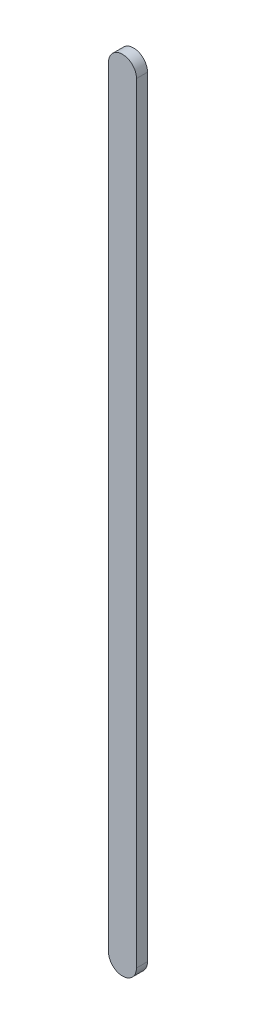
ISO-10303-21;
HEADER;
FILE_DESCRIPTION(('STEP AP214'),'2;1');
FILE_NAME('part.step','',(''),(''),'','','');
FILE_SCHEMA(('AUTOMOTIVE_DESIGN { 1 0 10303 214 1 1 1 1 }'));
ENDSEC;
DATA;
#1=APPLICATION_CONTEXT('core data for automotive mechanical design processes');
#2=APPLICATION_PROTOCOL_DEFINITION('international standard','automotive_design',2000,#1);
#3=PRODUCT_CONTEXT('',#1,'mechanical');
#4=PRODUCT('Part','Part','',(#3));
#5=PRODUCT_RELATED_PRODUCT_CATEGORY('part','',(#4));
#6=PRODUCT_DEFINITION_FORMATION('','',#4);
#7=PRODUCT_DEFINITION_CONTEXT('part definition',#1,'design');
#8=PRODUCT_DEFINITION('design','',#6,#7);
#9=PRODUCT_DEFINITION_SHAPE('','',#8);
#10=(LENGTH_UNIT() NAMED_UNIT(*) SI_UNIT(.MILLI.,.METRE.));
#11=(NAMED_UNIT(*) PLANE_ANGLE_UNIT() SI_UNIT($,.RADIAN.));
#12=(NAMED_UNIT(*) SI_UNIT($,.STERADIAN.) SOLID_ANGLE_UNIT());
#13=UNCERTAINTY_MEASURE_WITH_UNIT(LENGTH_MEASURE(1.E-05),#10,'distance_accuracy_value','');
#14=(GEOMETRIC_REPRESENTATION_CONTEXT(3) GLOBAL_UNCERTAINTY_ASSIGNED_CONTEXT((#13)) GLOBAL_UNIT_ASSIGNED_CONTEXT((#10,
#11,#12)) REPRESENTATION_CONTEXT('',''));
#15=CARTESIAN_POINT('',(0.,0.,0.));
#16=DIRECTION('',(0.,0.,1.));
#17=DIRECTION('',(1.,0.,0.));
#18=AXIS2_PLACEMENT_3D('',#15,#16,#17);
#19=CARTESIAN_POINT('',(155.829,103.759,0.));
#20=DIRECTION('',(-1.,0.,0.));
#21=DIRECTION('',(0.,1.,0.));
#22=AXIS2_PLACEMENT_3D('',#19,#20,#21);
#23=PLANE('',#22);
#24=DIRECTION('',(0.,1.,0.));
#25=VECTOR('',#24,1.);
#26=CARTESIAN_POINT('',(155.829,103.759,0.1999996));
#27=LINE('',#26,#25);
#28=CARTESIAN_POINT('',(155.829,103.759,0.1999996));
#29=VERTEX_POINT('',#28);
#30=CARTESIAN_POINT('',(155.829,117.729,0.1999996));
#31=VERTEX_POINT('',#30);
#32=EDGE_CURVE('E11',#29,#31,#27,.T.);
#33=ORIENTED_EDGE('',*,*,#32,.F.);
#34=DIRECTION('',(0.,0.,1.));
#35=VECTOR('',#34,1.);
#36=CARTESIAN_POINT('',(155.829,103.759,0.));
#37=LINE('',#36,#35);
#38=CARTESIAN_POINT('',(155.829,103.759,0.));
#39=VERTEX_POINT('',#38);
#40=EDGE_CURVE('E24',#39,#29,#37,.T.);
#41=ORIENTED_EDGE('',*,*,#40,.F.);
#42=DIRECTION('',(0.,1.,0.));
#43=VECTOR('',#42,1.);
#44=CARTESIAN_POINT('',(155.829,103.759,0.));
#45=LINE('',#44,#43);
#46=CARTESIAN_POINT('',(155.829,117.729,0.));
#47=VERTEX_POINT('',#46);
#48=EDGE_CURVE('E75',#39,#47,#45,.T.);
#49=ORIENTED_EDGE('',*,*,#48,.T.);
#50=DIRECTION('',(0.,0.,1.));
#51=VECTOR('',#50,1.);
#52=CARTESIAN_POINT('',(155.829,117.729,0.));
#53=LINE('',#52,#51);
#54=EDGE_CURVE('E37',#47,#31,#53,.T.);
#55=ORIENTED_EDGE('',*,*,#54,.T.);
#56=EDGE_LOOP('',(#33,#41,#49,#55));
#57=FACE_BOUND('',#56,.T.);
#58=ADVANCED_FACE('F17',(#57),#23,.F.);
#59=CARTESIAN_POINT('',(155.575,117.729,0.));
#60=DIRECTION('',(0.,0.,-1.));
#61=DIRECTION('',(1.,0.,0.));
#62=AXIS2_PLACEMENT_3D('',#59,#60,#61);
#63=CYLINDRICAL_SURFACE('',#62,0.25400000000001);
#64=CARTESIAN_POINT('',(155.575,117.729,0.1999996));
#65=DIRECTION('',(0.,0.,1.));
#66=DIRECTION('',(1.,0.,0.));
#67=AXIS2_PLACEMENT_3D('',#64,#65,#66);
#68=CIRCLE('',#67,0.25400000000001);
#69=CARTESIAN_POINT('',(155.321,117.729,0.1999996));
#70=VERTEX_POINT('',#69);
#71=EDGE_CURVE('E83',#31,#70,#68,.T.);
#72=ORIENTED_EDGE('',*,*,#71,.F.);
#73=ORIENTED_EDGE('',*,*,#54,.F.);
#74=CARTESIAN_POINT('',(155.575,117.729,0.));
#75=DIRECTION('',(0.,0.,1.));
#76=DIRECTION('',(1.,0.,0.));
#77=AXIS2_PLACEMENT_3D('',#74,#75,#76);
#78=CIRCLE('',#77,0.25400000000001);
#79=CARTESIAN_POINT('',(155.321,117.729,0.));
#80=VERTEX_POINT('',#79);
#81=EDGE_CURVE('E81',#47,#80,#78,.T.);
#82=ORIENTED_EDGE('',*,*,#81,.T.);
#83=DIRECTION('',(0.,0.,1.));
#84=VECTOR('',#83,1.);
#85=CARTESIAN_POINT('',(155.321,117.729,0.));
#86=LINE('',#85,#84);
#87=EDGE_CURVE('E67',#80,#70,#86,.T.);
#88=ORIENTED_EDGE('',*,*,#87,.T.);
#89=EDGE_LOOP('',(#72,#73,#82,#88));
#90=FACE_BOUND('',#89,.T.);
#91=ADVANCED_FACE('F89',(#90),#63,.T.);
#92=CARTESIAN_POINT('',(155.321,117.729,0.));
#93=DIRECTION('',(1.,0.,0.));
#94=DIRECTION('',(0.,-1.,0.));
#95=AXIS2_PLACEMENT_3D('',#92,#93,#94);
#96=PLANE('',#95);
#97=DIRECTION('',(0.,-1.,0.));
#98=VECTOR('',#97,1.);
#99=CARTESIAN_POINT('',(155.321,117.729,0.1999996));
#100=LINE('',#99,#98);
#101=CARTESIAN_POINT('',(155.321,103.759,0.1999996));
#102=VERTEX_POINT('',#101);
#103=EDGE_CURVE('E71',#70,#102,#100,.T.);
#104=ORIENTED_EDGE('',*,*,#103,.F.);
#105=ORIENTED_EDGE('',*,*,#87,.F.);
#106=DIRECTION('',(0.,-1.,0.));
#107=VECTOR('',#106,1.);
#108=CARTESIAN_POINT('',(155.321,117.729,0.));
#109=LINE('',#108,#107);
#110=CARTESIAN_POINT('',(155.321,103.759,0.));
#111=VERTEX_POINT('',#110);
#112=EDGE_CURVE('E63',#80,#111,#109,.T.);
#113=ORIENTED_EDGE('',*,*,#112,.T.);
#114=DIRECTION('',(0.,0.,1.));
#115=VECTOR('',#114,1.);
#116=CARTESIAN_POINT('',(155.321,103.759,0.));
#117=LINE('',#116,#115);
#118=EDGE_CURVE('E53',#111,#102,#117,.T.);
#119=ORIENTED_EDGE('',*,*,#118,.T.);
#120=EDGE_LOOP('',(#104,#105,#113,#119));
#121=FACE_BOUND('',#120,.T.);
#122=ADVANCED_FACE('F66',(#121),#96,.F.);
#123=CARTESIAN_POINT('',(155.575,103.759,0.));
#124=DIRECTION('',(0.,0.,-1.));
#125=DIRECTION('',(-1.,0.,0.));
#126=AXIS2_PLACEMENT_3D('',#123,#124,#125);
#127=CYLINDRICAL_SURFACE('',#126,0.25400000000001);
#128=CARTESIAN_POINT('',(155.575,103.759,0.1999996));
#129=DIRECTION('',(0.,0.,1.));
#130=DIRECTION('',(-1.,0.,0.));
#131=AXIS2_PLACEMENT_3D('',#128,#129,#130);
#132=CIRCLE('',#131,0.25400000000001);
#133=EDGE_CURVE('E59',#102,#29,#132,.T.);
#134=ORIENTED_EDGE('',*,*,#133,.F.);
#135=ORIENTED_EDGE('',*,*,#118,.F.);
#136=CARTESIAN_POINT('',(155.575,103.759,0.));
#137=DIRECTION('',(0.,0.,1.));
#138=DIRECTION('',(-1.,0.,0.));
#139=AXIS2_PLACEMENT_3D('',#136,#137,#138);
#140=CIRCLE('',#139,0.25400000000001);
#141=EDGE_CURVE('E57',#111,#39,#140,.T.);
#142=ORIENTED_EDGE('',*,*,#141,.T.);
#143=ORIENTED_EDGE('',*,*,#40,.T.);
#144=EDGE_LOOP('',(#134,#135,#142,#143));
#145=FACE_BOUND('',#144,.T.);
#146=ADVANCED_FACE('F55',(#145),#127,.T.);
#147=CARTESIAN_POINT('',(155.829,103.759,0.));
#148=DIRECTION('',(0.,0.,-1.));
#149=DIRECTION('',(-1.,0.,0.));
#150=AXIS2_PLACEMENT_3D('',#147,#148,#149);
#151=PLANE('',#150);
#152=ORIENTED_EDGE('',*,*,#141,.F.);
#153=ORIENTED_EDGE('',*,*,#112,.F.);
#154=ORIENTED_EDGE('',*,*,#81,.F.);
#155=ORIENTED_EDGE('',*,*,#48,.F.);
#156=EDGE_LOOP('',(#152,#153,#154,#155));
#157=FACE_BOUND('',#156,.T.);
#158=ADVANCED_FACE('F74',(#157),#151,.T.);
#159=CARTESIAN_POINT('',(155.829,103.759,0.1999996));
#160=DIRECTION('',(0.,0.,-1.));
#161=DIRECTION('',(-1.,0.,0.));
#162=AXIS2_PLACEMENT_3D('',#159,#160,#161);
#163=PLANE('',#162);
#164=ORIENTED_EDGE('',*,*,#32,.T.);
#165=ORIENTED_EDGE('',*,*,#71,.T.);
#166=ORIENTED_EDGE('',*,*,#103,.T.);
#167=ORIENTED_EDGE('',*,*,#133,.T.);
#168=EDGE_LOOP('',(#164,#165,#166,#167));
#169=FACE_BOUND('',#168,.T.);
#170=ADVANCED_FACE('F91',(#169),#163,.F.);
#171=CLOSED_SHELL('',(#58,#91,#122,#146,#158,#170));
#172=MANIFOLD_SOLID_BREP('B1',#171);
#173=ADVANCED_BREP_SHAPE_REPRESENTATION('',(#18,#172),#14);
#174=SHAPE_DEFINITION_REPRESENTATION(#9,#173);
ENDSEC;
END-ISO-10303-21;
